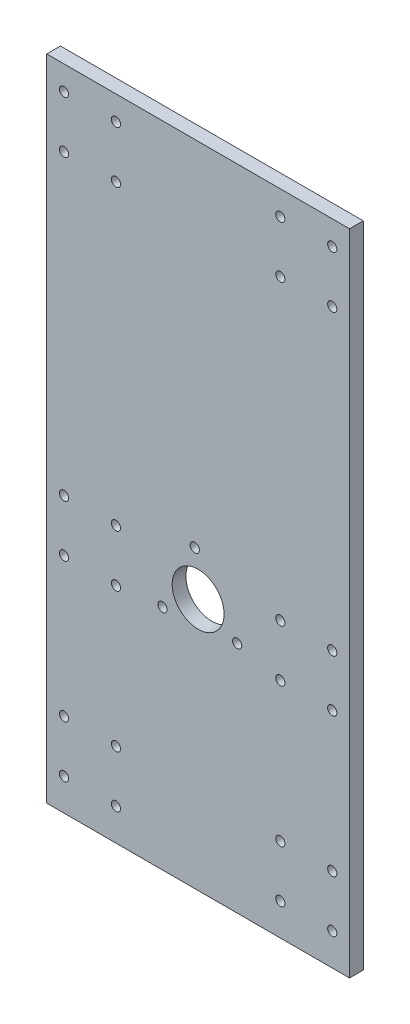
ISO-10303-21;
HEADER;
FILE_DESCRIPTION(('STEP AP214'),'2;1');
FILE_NAME('part.step','',(''),(''),'','','');
FILE_SCHEMA(('AUTOMOTIVE_DESIGN { 1 0 10303 214 1 1 1 1 }'));
ENDSEC;
DATA;
#1=APPLICATION_CONTEXT('core data for automotive mechanical design processes');
#2=APPLICATION_PROTOCOL_DEFINITION('international standard','automotive_design',2000,#1);
#3=PRODUCT_CONTEXT('',#1,'mechanical');
#4=PRODUCT('Part','Part','',(#3));
#5=PRODUCT_RELATED_PRODUCT_CATEGORY('part','',(#4));
#6=PRODUCT_DEFINITION_FORMATION('','',#4);
#7=PRODUCT_DEFINITION_CONTEXT('part definition',#1,'design');
#8=PRODUCT_DEFINITION('design','',#6,#7);
#9=PRODUCT_DEFINITION_SHAPE('','',#8);
#10=(LENGTH_UNIT() NAMED_UNIT(*) SI_UNIT(.MILLI.,.METRE.));
#11=(NAMED_UNIT(*) PLANE_ANGLE_UNIT() SI_UNIT($,.RADIAN.));
#12=(NAMED_UNIT(*) SI_UNIT($,.STERADIAN.) SOLID_ANGLE_UNIT());
#13=UNCERTAINTY_MEASURE_WITH_UNIT(LENGTH_MEASURE(1.E-05),#10,'distance_accuracy_value','');
#14=(GEOMETRIC_REPRESENTATION_CONTEXT(3) GLOBAL_UNCERTAINTY_ASSIGNED_CONTEXT((#13)) GLOBAL_UNIT_ASSIGNED_CONTEXT((#10,
#11,#12)) REPRESENTATION_CONTEXT('',''));
#15=CARTESIAN_POINT('',(0.,0.,0.));
#16=DIRECTION('',(0.,0.,1.));
#17=DIRECTION('',(1.,0.,0.));
#18=AXIS2_PLACEMENT_3D('',#15,#16,#17);
#19=CARTESIAN_POINT('',(0.,0.,6.35));
#20=DIRECTION('',(0.,0.,-1.));
#21=DIRECTION('',(-1.,0.,0.));
#22=AXIS2_PLACEMENT_3D('',#19,#20,#21);
#23=PLANE('',#22);
#24=CARTESIAN_POINT('',(-16.4847142677799,-44.6749368876676,6.35));
#25=DIRECTION('',(0.,0.,1.));
#26=DIRECTION('',(1.,0.,0.));
#27=AXIS2_PLACEMENT_3D('',#24,#25,#26);
#28=CIRCLE('',#27,2.125);
#29=CARTESIAN_POINT('',(-14.3597142677799,-44.6749368876676,6.35));
#30=VERTEX_POINT('',#29);
#31=EDGE_CURVE('E340',#30,#30,#28,.T.);
#32=ORIENTED_EDGE('',*,*,#31,.F.);
#33=EDGE_LOOP('',(#32));
#34=FACE_BOUND('',#33,.T.);
#35=CARTESIAN_POINT('',(18.0500401748656,-41.9637128861915,6.35));
#36=DIRECTION('',(0.,0.,1.));
#37=DIRECTION('',(1.,0.,0.));
#38=AXIS2_PLACEMENT_3D('',#35,#36,#37);
#39=CIRCLE('',#38,2.125);
#40=CARTESIAN_POINT('',(20.1750401748656,-41.9637128861915,6.35));
#41=VERTEX_POINT('',#40);
#42=EDGE_CURVE('E348',#41,#41,#39,.T.);
#43=ORIENTED_EDGE('',*,*,#42,.F.);
#44=EDGE_LOOP('',(#43));
#45=FACE_BOUND('',#44,.T.);
#46=CARTESIAN_POINT('',(-1.56532590708562,-13.4113502261411,6.35));
#47=DIRECTION('',(0.,0.,1.));
#48=DIRECTION('',(1.,0.,0.));
#49=AXIS2_PLACEMENT_3D('',#46,#47,#48);
#50=CIRCLE('',#49,2.125);
#51=CARTESIAN_POINT('',(0.559674092914378,-13.4113502261411,6.35));
#52=VERTEX_POINT('',#51);
#53=EDGE_CURVE('E332',#52,#52,#50,.T.);
#54=ORIENTED_EDGE('',*,*,#53,.F.);
#55=EDGE_LOOP('',(#54));
#56=FACE_BOUND('',#55,.T.);
#57=CARTESIAN_POINT('',(0.,-33.35,6.35));
#58=DIRECTION('',(0.,0.,1.));
#59=DIRECTION('',(1.,0.,0.));
#60=AXIS2_PLACEMENT_3D('',#57,#58,#59);
#61=CIRCLE('',#60,12.);
#62=CARTESIAN_POINT('',(12.,-33.35,6.35));
#63=VERTEX_POINT('',#62);
#64=EDGE_CURVE('E328',#63,#63,#61,.T.);
#65=ORIENTED_EDGE('',*,*,#64,.F.);
#66=EDGE_LOOP('',(#65));
#67=FACE_BOUND('',#66,.T.);
#68=DIRECTION('',(0.,1.,0.));
#69=VECTOR('',#68,1.);
#70=CARTESIAN_POINT('',(70.,-150.,6.35));
#71=LINE('',#70,#69);
#72=CARTESIAN_POINT('',(70.,-150.,6.35));
#73=VERTEX_POINT('',#72);
#74=CARTESIAN_POINT('',(70.,150.,6.35));
#75=VERTEX_POINT('',#74);
#76=EDGE_CURVE('E98',#73,#75,#71,.T.);
#77=ORIENTED_EDGE('',*,*,#76,.T.);
#78=DIRECTION('',(-1.,0.,0.));
#79=VECTOR('',#78,1.);
#80=CARTESIAN_POINT('',(-70.,150.,6.35));
#81=LINE('',#80,#79);
#82=CARTESIAN_POINT('',(-70.,150.,6.35));
#83=VERTEX_POINT('',#82);
#84=EDGE_CURVE('E93',#75,#83,#81,.T.);
#85=ORIENTED_EDGE('',*,*,#84,.T.);
#86=DIRECTION('',(0.,-1.,0.));
#87=VECTOR('',#86,1.);
#88=CARTESIAN_POINT('',(-70.,-150.,6.35));
#89=LINE('',#88,#87);
#90=CARTESIAN_POINT('',(-70.,-150.,6.35));
#91=VERTEX_POINT('',#90);
#92=EDGE_CURVE('E96',#83,#91,#89,.T.);
#93=ORIENTED_EDGE('',*,*,#92,.T.);
#94=DIRECTION('',(1.,0.,0.));
#95=VECTOR('',#94,1.);
#96=CARTESIAN_POINT('',(-70.,-150.,6.35));
#97=LINE('',#96,#95);
#98=EDGE_CURVE('E63',#91,#73,#97,.T.);
#99=ORIENTED_EDGE('',*,*,#98,.T.);
#100=EDGE_LOOP('',(#77,#85,#93,#99));
#101=FACE_BOUND('',#100,.T.);
#102=CARTESIAN_POINT('',(-62.,138.825,6.35));
#103=DIRECTION('',(0.,0.,1.));
#104=DIRECTION('',(1.,0.,0.));
#105=AXIS2_PLACEMENT_3D('',#102,#103,#104);
#106=CIRCLE('',#105,2.125);
#107=CARTESIAN_POINT('',(-59.875,138.825,6.35));
#108=VERTEX_POINT('',#107);
#109=EDGE_CURVE('E118',#108,#108,#106,.T.);
#110=ORIENTED_EDGE('',*,*,#109,.F.);
#111=EDGE_LOOP('',(#110));
#112=FACE_BOUND('',#111,.T.);
#113=CARTESIAN_POINT('',(-38.,138.825,6.35));
#114=DIRECTION('',(0.,0.,1.));
#115=DIRECTION('',(-1.,0.,0.));
#116=AXIS2_PLACEMENT_3D('',#113,#114,#115);
#117=CIRCLE('',#116,2.125);
#118=CARTESIAN_POINT('',(-40.125,138.825,6.35));
#119=VERTEX_POINT('',#118);
#120=EDGE_CURVE('E140',#119,#119,#117,.T.);
#121=ORIENTED_EDGE('',*,*,#120,.F.);
#122=EDGE_LOOP('',(#121));
#123=FACE_BOUND('',#122,.T.);
#124=CARTESIAN_POINT('',(-38.,114.825,6.35));
#125=DIRECTION('',(0.,0.,1.));
#126=DIRECTION('',(1.,0.,0.));
#127=AXIS2_PLACEMENT_3D('',#124,#125,#126);
#128=CIRCLE('',#127,2.125);
#129=CARTESIAN_POINT('',(-35.875,114.825,6.35));
#130=VERTEX_POINT('',#129);
#131=EDGE_CURVE('E148',#130,#130,#128,.T.);
#132=ORIENTED_EDGE('',*,*,#131,.F.);
#133=EDGE_LOOP('',(#132));
#134=FACE_BOUND('',#133,.T.);
#135=CARTESIAN_POINT('',(-62.,114.825,6.35));
#136=DIRECTION('',(0.,0.,1.));
#137=DIRECTION('',(-1.,0.,0.));
#138=AXIS2_PLACEMENT_3D('',#135,#136,#137);
#139=CIRCLE('',#138,2.125);
#140=CARTESIAN_POINT('',(-64.125,114.825,6.35));
#141=VERTEX_POINT('',#140);
#142=EDGE_CURVE('E156',#141,#141,#139,.T.);
#143=ORIENTED_EDGE('',*,*,#142,.F.);
#144=EDGE_LOOP('',(#143));
#145=FACE_BOUND('',#144,.T.);
#146=CARTESIAN_POINT('',(38.,114.825,6.35));
#147=DIRECTION('',(0.,0.,1.));
#148=DIRECTION('',(-1.,0.,0.));
#149=AXIS2_PLACEMENT_3D('',#146,#147,#148);
#150=CIRCLE('',#149,2.125);
#151=CARTESIAN_POINT('',(35.875,114.825,6.35));
#152=VERTEX_POINT('',#151);
#153=EDGE_CURVE('E164',#152,#152,#150,.T.);
#154=ORIENTED_EDGE('',*,*,#153,.F.);
#155=EDGE_LOOP('',(#154));
#156=FACE_BOUND('',#155,.T.);
#157=CARTESIAN_POINT('',(62.,114.825,6.35));
#158=DIRECTION('',(0.,0.,1.));
#159=DIRECTION('',(1.,0.,0.));
#160=AXIS2_PLACEMENT_3D('',#157,#158,#159);
#161=CIRCLE('',#160,2.12500000000001);
#162=CARTESIAN_POINT('',(64.125,114.825,6.35));
#163=VERTEX_POINT('',#162);
#164=EDGE_CURVE('E172',#163,#163,#161,.T.);
#165=ORIENTED_EDGE('',*,*,#164,.F.);
#166=EDGE_LOOP('',(#165));
#167=FACE_BOUND('',#166,.T.);
#168=CARTESIAN_POINT('',(38.,138.825,6.35));
#169=DIRECTION('',(0.,0.,1.));
#170=DIRECTION('',(1.,0.,0.));
#171=AXIS2_PLACEMENT_3D('',#168,#169,#170);
#172=CIRCLE('',#171,2.125);
#173=CARTESIAN_POINT('',(40.125,138.825,6.35));
#174=VERTEX_POINT('',#173);
#175=EDGE_CURVE('E180',#174,#174,#172,.T.);
#176=ORIENTED_EDGE('',*,*,#175,.F.);
#177=EDGE_LOOP('',(#176));
#178=FACE_BOUND('',#177,.T.);
#179=CARTESIAN_POINT('',(62.,138.825,6.35));
#180=DIRECTION('',(0.,0.,1.));
#181=DIRECTION('',(-1.,0.,0.));
#182=AXIS2_PLACEMENT_3D('',#179,#180,#181);
#183=CIRCLE('',#182,2.12500000000001);
#184=CARTESIAN_POINT('',(59.875,138.825,6.35));
#185=VERTEX_POINT('',#184);
#186=EDGE_CURVE('E188',#185,#185,#183,.T.);
#187=ORIENTED_EDGE('',*,*,#186,.F.);
#188=EDGE_LOOP('',(#187));
#189=FACE_BOUND('',#188,.T.);
#190=CARTESIAN_POINT('',(62.,-46.825,6.35));
#191=DIRECTION('',(0.,0.,1.));
#192=DIRECTION('',(1.,0.,0.));
#193=AXIS2_PLACEMENT_3D('',#190,#191,#192);
#194=CIRCLE('',#193,2.12500000000005);
#195=CARTESIAN_POINT('',(64.1250000000001,-46.825,6.35));
#196=VERTEX_POINT('',#195);
#197=EDGE_CURVE('E196',#196,#196,#194,.T.);
#198=ORIENTED_EDGE('',*,*,#197,.F.);
#199=EDGE_LOOP('',(#198));
#200=FACE_BOUND('',#199,.T.);
#201=CARTESIAN_POINT('',(38.,-46.825,6.35));
#202=DIRECTION('',(0.,0.,1.));
#203=DIRECTION('',(-1.,0.,0.));
#204=AXIS2_PLACEMENT_3D('',#201,#202,#203);
#205=CIRCLE('',#204,2.12499999999998);
#206=CARTESIAN_POINT('',(35.875,-46.825,6.35));
#207=VERTEX_POINT('',#206);
#208=EDGE_CURVE('E204',#207,#207,#205,.T.);
#209=ORIENTED_EDGE('',*,*,#208,.F.);
#210=EDGE_LOOP('',(#209));
#211=FACE_BOUND('',#210,.T.);
#212=CARTESIAN_POINT('',(62.,-22.825,6.35));
#213=DIRECTION('',(0.,0.,1.));
#214=DIRECTION('',(-1.,0.,0.));
#215=AXIS2_PLACEMENT_3D('',#212,#213,#214);
#216=CIRCLE('',#215,2.12500000000004);
#217=CARTESIAN_POINT('',(59.875,-22.825,6.35));
#218=VERTEX_POINT('',#217);
#219=EDGE_CURVE('E212',#218,#218,#216,.T.);
#220=ORIENTED_EDGE('',*,*,#219,.F.);
#221=EDGE_LOOP('',(#220));
#222=FACE_BOUND('',#221,.T.);
#223=CARTESIAN_POINT('',(38.,-22.825,6.35));
#224=DIRECTION('',(0.,0.,1.));
#225=DIRECTION('',(1.,0.,0.));
#226=AXIS2_PLACEMENT_3D('',#223,#224,#225);
#227=CIRCLE('',#226,2.12499999999999);
#228=CARTESIAN_POINT('',(40.125,-22.825,6.35));
#229=VERTEX_POINT('',#228);
#230=EDGE_CURVE('E220',#229,#229,#227,.T.);
#231=ORIENTED_EDGE('',*,*,#230,.F.);
#232=EDGE_LOOP('',(#231));
#233=FACE_BOUND('',#232,.T.);
#234=CARTESIAN_POINT('',(-62.,-22.825,6.35));
#235=DIRECTION('',(0.,0.,1.));
#236=DIRECTION('',(1.,0.,0.));
#237=AXIS2_PLACEMENT_3D('',#234,#235,#236);
#238=CIRCLE('',#237,2.12499999999999);
#239=CARTESIAN_POINT('',(-59.875,-22.825,6.35));
#240=VERTEX_POINT('',#239);
#241=EDGE_CURVE('E228',#240,#240,#238,.T.);
#242=ORIENTED_EDGE('',*,*,#241,.F.);
#243=EDGE_LOOP('',(#242));
#244=FACE_BOUND('',#243,.T.);
#245=CARTESIAN_POINT('',(-38.,-22.825,6.35));
#246=DIRECTION('',(0.,0.,1.));
#247=DIRECTION('',(-1.,0.,0.));
#248=AXIS2_PLACEMENT_3D('',#245,#246,#247);
#249=CIRCLE('',#248,2.12499999999999);
#250=CARTESIAN_POINT('',(-40.125,-22.825,6.35));
#251=VERTEX_POINT('',#250);
#252=EDGE_CURVE('E236',#251,#251,#249,.T.);
#253=ORIENTED_EDGE('',*,*,#252,.F.);
#254=EDGE_LOOP('',(#253));
#255=FACE_BOUND('',#254,.T.);
#256=CARTESIAN_POINT('',(-38.,-46.825,6.35));
#257=DIRECTION('',(0.,0.,1.));
#258=DIRECTION('',(1.,0.,0.));
#259=AXIS2_PLACEMENT_3D('',#256,#257,#258);
#260=CIRCLE('',#259,2.12499999999998);
#261=CARTESIAN_POINT('',(-35.875,-46.825,6.35));
#262=VERTEX_POINT('',#261);
#263=EDGE_CURVE('E244',#262,#262,#260,.T.);
#264=ORIENTED_EDGE('',*,*,#263,.F.);
#265=EDGE_LOOP('',(#264));
#266=FACE_BOUND('',#265,.T.);
#267=CARTESIAN_POINT('',(-62.,-46.825,6.35));
#268=DIRECTION('',(0.,0.,1.));
#269=DIRECTION('',(-1.,0.,0.));
#270=AXIS2_PLACEMENT_3D('',#267,#268,#269);
#271=CIRCLE('',#270,2.12499999999998);
#272=CARTESIAN_POINT('',(-64.125,-46.825,6.35));
#273=VERTEX_POINT('',#272);
#274=EDGE_CURVE('E252',#273,#273,#271,.T.);
#275=ORIENTED_EDGE('',*,*,#274,.F.);
#276=EDGE_LOOP('',(#275));
#277=FACE_BOUND('',#276,.T.);
#278=CARTESIAN_POINT('',(-62.,-111.175,6.35));
#279=DIRECTION('',(0.,0.,1.));
#280=DIRECTION('',(1.,0.,0.));
#281=AXIS2_PLACEMENT_3D('',#278,#279,#280);
#282=CIRCLE('',#281,2.125);
#283=CARTESIAN_POINT('',(-59.875,-111.175,6.35));
#284=VERTEX_POINT('',#283);
#285=EDGE_CURVE('E260',#284,#284,#282,.T.);
#286=ORIENTED_EDGE('',*,*,#285,.F.);
#287=EDGE_LOOP('',(#286));
#288=FACE_BOUND('',#287,.T.);
#289=CARTESIAN_POINT('',(-38.,-111.175,6.35));
#290=DIRECTION('',(0.,0.,1.));
#291=DIRECTION('',(-1.,0.,0.));
#292=AXIS2_PLACEMENT_3D('',#289,#290,#291);
#293=CIRCLE('',#292,2.12500000000001);
#294=CARTESIAN_POINT('',(-40.125,-111.175,6.35));
#295=VERTEX_POINT('',#294);
#296=EDGE_CURVE('E268',#295,#295,#293,.T.);
#297=ORIENTED_EDGE('',*,*,#296,.F.);
#298=EDGE_LOOP('',(#297));
#299=FACE_BOUND('',#298,.T.);
#300=CARTESIAN_POINT('',(-38.,-135.175,6.35));
#301=DIRECTION('',(0.,0.,1.));
#302=DIRECTION('',(1.,0.,0.));
#303=AXIS2_PLACEMENT_3D('',#300,#301,#302);
#304=CIRCLE('',#303,2.12500000000002);
#305=CARTESIAN_POINT('',(-35.875,-135.175,6.35));
#306=VERTEX_POINT('',#305);
#307=EDGE_CURVE('E276',#306,#306,#304,.T.);
#308=ORIENTED_EDGE('',*,*,#307,.F.);
#309=EDGE_LOOP('',(#308));
#310=FACE_BOUND('',#309,.T.);
#311=CARTESIAN_POINT('',(-62.,-135.175,6.35));
#312=DIRECTION('',(0.,0.,1.));
#313=DIRECTION('',(-1.,0.,0.));
#314=AXIS2_PLACEMENT_3D('',#311,#312,#313);
#315=CIRCLE('',#314,2.125);
#316=CARTESIAN_POINT('',(-64.125,-135.175,6.35));
#317=VERTEX_POINT('',#316);
#318=EDGE_CURVE('E284',#317,#317,#315,.T.);
#319=ORIENTED_EDGE('',*,*,#318,.F.);
#320=EDGE_LOOP('',(#319));
#321=FACE_BOUND('',#320,.T.);
#322=CARTESIAN_POINT('',(38.,-135.175,6.35));
#323=DIRECTION('',(0.,0.,1.));
#324=DIRECTION('',(-1.,0.,0.));
#325=AXIS2_PLACEMENT_3D('',#322,#323,#324);
#326=CIRCLE('',#325,2.12499999999999);
#327=CARTESIAN_POINT('',(35.875,-135.175,6.35));
#328=VERTEX_POINT('',#327);
#329=EDGE_CURVE('E292',#328,#328,#326,.T.);
#330=ORIENTED_EDGE('',*,*,#329,.F.);
#331=EDGE_LOOP('',(#330));
#332=FACE_BOUND('',#331,.T.);
#333=CARTESIAN_POINT('',(62.,-135.175,6.35));
#334=DIRECTION('',(0.,0.,1.));
#335=DIRECTION('',(1.,0.,0.));
#336=AXIS2_PLACEMENT_3D('',#333,#334,#335);
#337=CIRCLE('',#336,2.12500000000002);
#338=CARTESIAN_POINT('',(64.125,-135.175,6.35));
#339=VERTEX_POINT('',#338);
#340=EDGE_CURVE('E300',#339,#339,#337,.T.);
#341=ORIENTED_EDGE('',*,*,#340,.F.);
#342=EDGE_LOOP('',(#341));
#343=FACE_BOUND('',#342,.T.);
#344=CARTESIAN_POINT('',(38.,-111.175,6.35));
#345=DIRECTION('',(0.,0.,1.));
#346=DIRECTION('',(1.,0.,0.));
#347=AXIS2_PLACEMENT_3D('',#344,#345,#346);
#348=CIRCLE('',#347,2.125);
#349=CARTESIAN_POINT('',(40.125,-111.175,6.35));
#350=VERTEX_POINT('',#349);
#351=EDGE_CURVE('E308',#350,#350,#348,.T.);
#352=ORIENTED_EDGE('',*,*,#351,.F.);
#353=EDGE_LOOP('',(#352));
#354=FACE_BOUND('',#353,.T.);
#355=CARTESIAN_POINT('',(62.,-111.175,6.35));
#356=DIRECTION('',(0.,0.,1.));
#357=DIRECTION('',(-1.,0.,0.));
#358=AXIS2_PLACEMENT_3D('',#355,#356,#357);
#359=CIRCLE('',#358,2.12500000000001);
#360=CARTESIAN_POINT('',(59.875,-111.175,6.35));
#361=VERTEX_POINT('',#360);
#362=EDGE_CURVE('E316',#361,#361,#359,.T.);
#363=ORIENTED_EDGE('',*,*,#362,.F.);
#364=EDGE_LOOP('',(#363));
#365=FACE_BOUND('',#364,.T.);
#366=ADVANCED_FACE('F45',(#34,#45,#56,#67,#101,#112,#123,#134,#145,#156,#167,#178,#189,#200,
#211,#222,#233,#244,#255,#266,#277,#288,#299,#310,#321,#332,#343,#354,#365),#23,.F.);
#367=CARTESIAN_POINT('',(0.,0.,0.));
#368=DIRECTION('',(0.,0.,-1.));
#369=DIRECTION('',(-1.,0.,0.));
#370=AXIS2_PLACEMENT_3D('',#367,#368,#369);
#371=PLANE('',#370);
#372=CARTESIAN_POINT('',(-16.4847142677799,-44.6749368876676,0.));
#373=DIRECTION('',(0.,0.,1.));
#374=DIRECTION('',(1.,0.,0.));
#375=AXIS2_PLACEMENT_3D('',#372,#373,#374);
#376=CIRCLE('',#375,2.125);
#377=CARTESIAN_POINT('',(-14.3597142677799,-44.6749368876676,0.));
#378=VERTEX_POINT('',#377);
#379=EDGE_CURVE('E336',#378,#378,#376,.T.);
#380=ORIENTED_EDGE('',*,*,#379,.T.);
#381=EDGE_LOOP('',(#380));
#382=FACE_BOUND('',#381,.T.);
#383=CARTESIAN_POINT('',(18.0500401748656,-41.9637128861915,0.));
#384=DIRECTION('',(0.,0.,1.));
#385=DIRECTION('',(1.,0.,0.));
#386=AXIS2_PLACEMENT_3D('',#383,#384,#385);
#387=CIRCLE('',#386,2.125);
#388=CARTESIAN_POINT('',(20.1750401748656,-41.9637128861915,0.));
#389=VERTEX_POINT('',#388);
#390=EDGE_CURVE('E344',#389,#389,#387,.T.);
#391=ORIENTED_EDGE('',*,*,#390,.T.);
#392=EDGE_LOOP('',(#391));
#393=FACE_BOUND('',#392,.T.);
#394=CARTESIAN_POINT('',(-1.56532590708562,-13.4113502261411,0.));
#395=DIRECTION('',(0.,0.,1.));
#396=DIRECTION('',(1.,0.,0.));
#397=AXIS2_PLACEMENT_3D('',#394,#395,#396);
#398=CIRCLE('',#397,2.125);
#399=CARTESIAN_POINT('',(0.559674092914378,-13.4113502261411,0.));
#400=VERTEX_POINT('',#399);
#401=EDGE_CURVE('E352',#400,#400,#398,.T.);
#402=ORIENTED_EDGE('',*,*,#401,.T.);
#403=EDGE_LOOP('',(#402));
#404=FACE_BOUND('',#403,.T.);
#405=CARTESIAN_POINT('',(0.,-33.35,0.));
#406=DIRECTION('',(0.,0.,1.));
#407=DIRECTION('',(1.,0.,0.));
#408=AXIS2_PLACEMENT_3D('',#405,#406,#407);
#409=CIRCLE('',#408,12.);
#410=CARTESIAN_POINT('',(12.,-33.35,0.));
#411=VERTEX_POINT('',#410);
#412=EDGE_CURVE('E324',#411,#411,#409,.T.);
#413=ORIENTED_EDGE('',*,*,#412,.T.);
#414=EDGE_LOOP('',(#413));
#415=FACE_BOUND('',#414,.T.);
#416=CARTESIAN_POINT('',(38.,-111.175,0.));
#417=DIRECTION('',(0.,0.,1.));
#418=DIRECTION('',(1.,0.,0.));
#419=AXIS2_PLACEMENT_3D('',#416,#417,#418);
#420=CIRCLE('',#419,2.125);
#421=CARTESIAN_POINT('',(40.125,-111.175,0.));
#422=VERTEX_POINT('',#421);
#423=EDGE_CURVE('E312',#422,#422,#420,.T.);
#424=ORIENTED_EDGE('',*,*,#423,.T.);
#425=EDGE_LOOP('',(#424));
#426=FACE_BOUND('',#425,.T.);
#427=CARTESIAN_POINT('',(38.,-135.175,0.));
#428=DIRECTION('',(0.,0.,1.));
#429=DIRECTION('',(-1.,0.,0.));
#430=AXIS2_PLACEMENT_3D('',#427,#428,#429);
#431=CIRCLE('',#430,2.12499999999999);
#432=CARTESIAN_POINT('',(35.875,-135.175,0.));
#433=VERTEX_POINT('',#432);
#434=EDGE_CURVE('E296',#433,#433,#431,.T.);
#435=ORIENTED_EDGE('',*,*,#434,.T.);
#436=EDGE_LOOP('',(#435));
#437=FACE_BOUND('',#436,.T.);
#438=CARTESIAN_POINT('',(-38.,-135.175,0.));
#439=DIRECTION('',(0.,0.,1.));
#440=DIRECTION('',(1.,0.,0.));
#441=AXIS2_PLACEMENT_3D('',#438,#439,#440);
#442=CIRCLE('',#441,2.12500000000002);
#443=CARTESIAN_POINT('',(-35.875,-135.175,0.));
#444=VERTEX_POINT('',#443);
#445=EDGE_CURVE('E280',#444,#444,#442,.T.);
#446=ORIENTED_EDGE('',*,*,#445,.T.);
#447=EDGE_LOOP('',(#446));
#448=FACE_BOUND('',#447,.T.);
#449=CARTESIAN_POINT('',(-62.,-111.175,0.));
#450=DIRECTION('',(0.,0.,1.));
#451=DIRECTION('',(1.,0.,0.));
#452=AXIS2_PLACEMENT_3D('',#449,#450,#451);
#453=CIRCLE('',#452,2.125);
#454=CARTESIAN_POINT('',(-59.875,-111.175,0.));
#455=VERTEX_POINT('',#454);
#456=EDGE_CURVE('E264',#455,#455,#453,.T.);
#457=ORIENTED_EDGE('',*,*,#456,.T.);
#458=EDGE_LOOP('',(#457));
#459=FACE_BOUND('',#458,.T.);
#460=CARTESIAN_POINT('',(-38.,-46.825,0.));
#461=DIRECTION('',(0.,0.,1.));
#462=DIRECTION('',(1.,0.,0.));
#463=AXIS2_PLACEMENT_3D('',#460,#461,#462);
#464=CIRCLE('',#463,2.12499999999998);
#465=CARTESIAN_POINT('',(-35.875,-46.825,0.));
#466=VERTEX_POINT('',#465);
#467=EDGE_CURVE('E248',#466,#466,#464,.T.);
#468=ORIENTED_EDGE('',*,*,#467,.T.);
#469=EDGE_LOOP('',(#468));
#470=FACE_BOUND('',#469,.T.);
#471=CARTESIAN_POINT('',(-62.,-22.825,0.));
#472=DIRECTION('',(0.,0.,1.));
#473=DIRECTION('',(1.,0.,0.));
#474=AXIS2_PLACEMENT_3D('',#471,#472,#473);
#475=CIRCLE('',#474,2.12499999999999);
#476=CARTESIAN_POINT('',(-59.875,-22.825,0.));
#477=VERTEX_POINT('',#476);
#478=EDGE_CURVE('E232',#477,#477,#475,.T.);
#479=ORIENTED_EDGE('',*,*,#478,.T.);
#480=EDGE_LOOP('',(#479));
#481=FACE_BOUND('',#480,.T.);
#482=CARTESIAN_POINT('',(62.,-22.825,0.));
#483=DIRECTION('',(0.,0.,1.));
#484=DIRECTION('',(-1.,0.,0.));
#485=AXIS2_PLACEMENT_3D('',#482,#483,#484);
#486=CIRCLE('',#485,2.12500000000004);
#487=CARTESIAN_POINT('',(59.875,-22.825,0.));
#488=VERTEX_POINT('',#487);
#489=EDGE_CURVE('E216',#488,#488,#486,.T.);
#490=ORIENTED_EDGE('',*,*,#489,.T.);
#491=EDGE_LOOP('',(#490));
#492=FACE_BOUND('',#491,.T.);
#493=CARTESIAN_POINT('',(62.,-46.825,0.));
#494=DIRECTION('',(0.,0.,1.));
#495=DIRECTION('',(1.,0.,0.));
#496=AXIS2_PLACEMENT_3D('',#493,#494,#495);
#497=CIRCLE('',#496,2.12500000000005);
#498=CARTESIAN_POINT('',(64.1250000000001,-46.825,0.));
#499=VERTEX_POINT('',#498);
#500=EDGE_CURVE('E200',#499,#499,#497,.T.);
#501=ORIENTED_EDGE('',*,*,#500,.T.);
#502=EDGE_LOOP('',(#501));
#503=FACE_BOUND('',#502,.T.);
#504=CARTESIAN_POINT('',(38.,138.825,0.));
#505=DIRECTION('',(0.,0.,1.));
#506=DIRECTION('',(1.,0.,0.));
#507=AXIS2_PLACEMENT_3D('',#504,#505,#506);
#508=CIRCLE('',#507,2.125);
#509=CARTESIAN_POINT('',(40.125,138.825,0.));
#510=VERTEX_POINT('',#509);
#511=EDGE_CURVE('E184',#510,#510,#508,.T.);
#512=ORIENTED_EDGE('',*,*,#511,.T.);
#513=EDGE_LOOP('',(#512));
#514=FACE_BOUND('',#513,.T.);
#515=CARTESIAN_POINT('',(38.,114.825,0.));
#516=DIRECTION('',(0.,0.,1.));
#517=DIRECTION('',(-1.,0.,0.));
#518=AXIS2_PLACEMENT_3D('',#515,#516,#517);
#519=CIRCLE('',#518,2.125);
#520=CARTESIAN_POINT('',(35.875,114.825,0.));
#521=VERTEX_POINT('',#520);
#522=EDGE_CURVE('E168',#521,#521,#519,.T.);
#523=ORIENTED_EDGE('',*,*,#522,.T.);
#524=EDGE_LOOP('',(#523));
#525=FACE_BOUND('',#524,.T.);
#526=CARTESIAN_POINT('',(-38.,114.825,0.));
#527=DIRECTION('',(0.,0.,1.));
#528=DIRECTION('',(1.,0.,0.));
#529=AXIS2_PLACEMENT_3D('',#526,#527,#528);
#530=CIRCLE('',#529,2.125);
#531=CARTESIAN_POINT('',(-35.875,114.825,0.));
#532=VERTEX_POINT('',#531);
#533=EDGE_CURVE('E152',#532,#532,#530,.T.);
#534=ORIENTED_EDGE('',*,*,#533,.T.);
#535=EDGE_LOOP('',(#534));
#536=FACE_BOUND('',#535,.T.);
#537=CARTESIAN_POINT('',(-62.,138.825,0.));
#538=DIRECTION('',(0.,0.,1.));
#539=DIRECTION('',(1.,0.,0.));
#540=AXIS2_PLACEMENT_3D('',#537,#538,#539);
#541=CIRCLE('',#540,2.125);
#542=CARTESIAN_POINT('',(-59.875,138.825,0.));
#543=VERTEX_POINT('',#542);
#544=EDGE_CURVE('E136',#543,#543,#541,.T.);
#545=ORIENTED_EDGE('',*,*,#544,.T.);
#546=EDGE_LOOP('',(#545));
#547=FACE_BOUND('',#546,.T.);
#548=DIRECTION('',(0.,1.,0.));
#549=VECTOR('',#548,1.);
#550=CARTESIAN_POINT('',(70.,-150.,0.));
#551=LINE('',#550,#549);
#552=CARTESIAN_POINT('',(70.,-150.,0.));
#553=VERTEX_POINT('',#552);
#554=CARTESIAN_POINT('',(70.,150.,0.));
#555=VERTEX_POINT('',#554);
#556=EDGE_CURVE('E114',#553,#555,#551,.T.);
#557=ORIENTED_EDGE('',*,*,#556,.F.);
#558=DIRECTION('',(1.,0.,0.));
#559=VECTOR('',#558,1.);
#560=CARTESIAN_POINT('',(-70.,-150.,0.));
#561=LINE('',#560,#559);
#562=CARTESIAN_POINT('',(-70.,-150.,0.));
#563=VERTEX_POINT('',#562);
#564=EDGE_CURVE('E86',#563,#553,#561,.T.);
#565=ORIENTED_EDGE('',*,*,#564,.F.);
#566=DIRECTION('',(0.,-1.,0.));
#567=VECTOR('',#566,1.);
#568=CARTESIAN_POINT('',(-70.,-150.,0.));
#569=LINE('',#568,#567);
#570=CARTESIAN_POINT('',(-70.,150.,0.));
#571=VERTEX_POINT('',#570);
#572=EDGE_CURVE('E80',#571,#563,#569,.T.);
#573=ORIENTED_EDGE('',*,*,#572,.F.);
#574=DIRECTION('',(-1.,0.,0.));
#575=VECTOR('',#574,1.);
#576=CARTESIAN_POINT('',(-70.,150.,0.));
#577=LINE('',#576,#575);
#578=EDGE_CURVE('E103',#555,#571,#577,.T.);
#579=ORIENTED_EDGE('',*,*,#578,.F.);
#580=EDGE_LOOP('',(#557,#565,#573,#579));
#581=FACE_BOUND('',#580,.T.);
#582=CARTESIAN_POINT('',(-38.,138.825,0.));
#583=DIRECTION('',(0.,0.,1.));
#584=DIRECTION('',(-1.,0.,0.));
#585=AXIS2_PLACEMENT_3D('',#582,#583,#584);
#586=CIRCLE('',#585,2.125);
#587=CARTESIAN_POINT('',(-40.125,138.825,0.));
#588=VERTEX_POINT('',#587);
#589=EDGE_CURVE('E144',#588,#588,#586,.T.);
#590=ORIENTED_EDGE('',*,*,#589,.T.);
#591=EDGE_LOOP('',(#590));
#592=FACE_BOUND('',#591,.T.);
#593=CARTESIAN_POINT('',(-62.,114.825,0.));
#594=DIRECTION('',(0.,0.,1.));
#595=DIRECTION('',(-1.,0.,0.));
#596=AXIS2_PLACEMENT_3D('',#593,#594,#595);
#597=CIRCLE('',#596,2.125);
#598=CARTESIAN_POINT('',(-64.125,114.825,0.));
#599=VERTEX_POINT('',#598);
#600=EDGE_CURVE('E160',#599,#599,#597,.T.);
#601=ORIENTED_EDGE('',*,*,#600,.T.);
#602=EDGE_LOOP('',(#601));
#603=FACE_BOUND('',#602,.T.);
#604=CARTESIAN_POINT('',(62.,114.825,0.));
#605=DIRECTION('',(0.,0.,1.));
#606=DIRECTION('',(1.,0.,0.));
#607=AXIS2_PLACEMENT_3D('',#604,#605,#606);
#608=CIRCLE('',#607,2.12500000000001);
#609=CARTESIAN_POINT('',(64.125,114.825,0.));
#610=VERTEX_POINT('',#609);
#611=EDGE_CURVE('E176',#610,#610,#608,.T.);
#612=ORIENTED_EDGE('',*,*,#611,.T.);
#613=EDGE_LOOP('',(#612));
#614=FACE_BOUND('',#613,.T.);
#615=CARTESIAN_POINT('',(62.,138.825,0.));
#616=DIRECTION('',(0.,0.,1.));
#617=DIRECTION('',(-1.,0.,0.));
#618=AXIS2_PLACEMENT_3D('',#615,#616,#617);
#619=CIRCLE('',#618,2.12500000000001);
#620=CARTESIAN_POINT('',(59.875,138.825,0.));
#621=VERTEX_POINT('',#620);
#622=EDGE_CURVE('E192',#621,#621,#619,.T.);
#623=ORIENTED_EDGE('',*,*,#622,.T.);
#624=EDGE_LOOP('',(#623));
#625=FACE_BOUND('',#624,.T.);
#626=CARTESIAN_POINT('',(38.,-46.825,0.));
#627=DIRECTION('',(0.,0.,1.));
#628=DIRECTION('',(-1.,0.,0.));
#629=AXIS2_PLACEMENT_3D('',#626,#627,#628);
#630=CIRCLE('',#629,2.12499999999998);
#631=CARTESIAN_POINT('',(35.875,-46.825,0.));
#632=VERTEX_POINT('',#631);
#633=EDGE_CURVE('E208',#632,#632,#630,.T.);
#634=ORIENTED_EDGE('',*,*,#633,.T.);
#635=EDGE_LOOP('',(#634));
#636=FACE_BOUND('',#635,.T.);
#637=CARTESIAN_POINT('',(38.,-22.825,0.));
#638=DIRECTION('',(0.,0.,1.));
#639=DIRECTION('',(1.,0.,0.));
#640=AXIS2_PLACEMENT_3D('',#637,#638,#639);
#641=CIRCLE('',#640,2.12499999999999);
#642=CARTESIAN_POINT('',(40.125,-22.825,0.));
#643=VERTEX_POINT('',#642);
#644=EDGE_CURVE('E224',#643,#643,#641,.T.);
#645=ORIENTED_EDGE('',*,*,#644,.T.);
#646=EDGE_LOOP('',(#645));
#647=FACE_BOUND('',#646,.T.);
#648=CARTESIAN_POINT('',(-38.,-22.825,0.));
#649=DIRECTION('',(0.,0.,1.));
#650=DIRECTION('',(-1.,0.,0.));
#651=AXIS2_PLACEMENT_3D('',#648,#649,#650);
#652=CIRCLE('',#651,2.12499999999999);
#653=CARTESIAN_POINT('',(-40.125,-22.825,0.));
#654=VERTEX_POINT('',#653);
#655=EDGE_CURVE('E240',#654,#654,#652,.T.);
#656=ORIENTED_EDGE('',*,*,#655,.T.);
#657=EDGE_LOOP('',(#656));
#658=FACE_BOUND('',#657,.T.);
#659=CARTESIAN_POINT('',(-62.,-46.825,0.));
#660=DIRECTION('',(0.,0.,1.));
#661=DIRECTION('',(-1.,0.,0.));
#662=AXIS2_PLACEMENT_3D('',#659,#660,#661);
#663=CIRCLE('',#662,2.12499999999998);
#664=CARTESIAN_POINT('',(-64.125,-46.825,0.));
#665=VERTEX_POINT('',#664);
#666=EDGE_CURVE('E256',#665,#665,#663,.T.);
#667=ORIENTED_EDGE('',*,*,#666,.T.);
#668=EDGE_LOOP('',(#667));
#669=FACE_BOUND('',#668,.T.);
#670=CARTESIAN_POINT('',(-38.,-111.175,0.));
#671=DIRECTION('',(0.,0.,1.));
#672=DIRECTION('',(-1.,0.,0.));
#673=AXIS2_PLACEMENT_3D('',#670,#671,#672);
#674=CIRCLE('',#673,2.12500000000001);
#675=CARTESIAN_POINT('',(-40.125,-111.175,0.));
#676=VERTEX_POINT('',#675);
#677=EDGE_CURVE('E272',#676,#676,#674,.T.);
#678=ORIENTED_EDGE('',*,*,#677,.T.);
#679=EDGE_LOOP('',(#678));
#680=FACE_BOUND('',#679,.T.);
#681=CARTESIAN_POINT('',(-62.,-135.175,0.));
#682=DIRECTION('',(0.,0.,1.));
#683=DIRECTION('',(-1.,0.,0.));
#684=AXIS2_PLACEMENT_3D('',#681,#682,#683);
#685=CIRCLE('',#684,2.125);
#686=CARTESIAN_POINT('',(-64.125,-135.175,0.));
#687=VERTEX_POINT('',#686);
#688=EDGE_CURVE('E288',#687,#687,#685,.T.);
#689=ORIENTED_EDGE('',*,*,#688,.T.);
#690=EDGE_LOOP('',(#689));
#691=FACE_BOUND('',#690,.T.);
#692=CARTESIAN_POINT('',(62.,-135.175,0.));
#693=DIRECTION('',(0.,0.,1.));
#694=DIRECTION('',(1.,0.,0.));
#695=AXIS2_PLACEMENT_3D('',#692,#693,#694);
#696=CIRCLE('',#695,2.12500000000002);
#697=CARTESIAN_POINT('',(64.125,-135.175,0.));
#698=VERTEX_POINT('',#697);
#699=EDGE_CURVE('E304',#698,#698,#696,.T.);
#700=ORIENTED_EDGE('',*,*,#699,.T.);
#701=EDGE_LOOP('',(#700));
#702=FACE_BOUND('',#701,.T.);
#703=CARTESIAN_POINT('',(62.,-111.175,0.));
#704=DIRECTION('',(0.,0.,1.));
#705=DIRECTION('',(-1.,0.,0.));
#706=AXIS2_PLACEMENT_3D('',#703,#704,#705);
#707=CIRCLE('',#706,2.12500000000001);
#708=CARTESIAN_POINT('',(59.875,-111.175,0.));
#709=VERTEX_POINT('',#708);
#710=EDGE_CURVE('E320',#709,#709,#707,.T.);
#711=ORIENTED_EDGE('',*,*,#710,.T.);
#712=EDGE_LOOP('',(#711));
#713=FACE_BOUND('',#712,.T.);
#714=ADVANCED_FACE('F131',(#382,#393,#404,#415,#426,#437,#448,#459,#470,#481,#492,#503,#514,
#525,#536,#547,#581,#592,#603,#614,#625,#636,#647,#658,#669,#680,#691,#702,#713),#371,.T.);
#715=CARTESIAN_POINT('',(70.,-150.,6.35));
#716=DIRECTION('',(-1.,0.,0.));
#717=DIRECTION('',(0.,0.,1.));
#718=AXIS2_PLACEMENT_3D('',#715,#716,#717);
#719=PLANE('',#718);
#720=ORIENTED_EDGE('',*,*,#556,.T.);
#721=DIRECTION('',(0.,0.,-1.));
#722=VECTOR('',#721,1.);
#723=CARTESIAN_POINT('',(70.,150.,6.35));
#724=LINE('',#723,#722);
#725=EDGE_CURVE('E11',#75,#555,#724,.T.);
#726=ORIENTED_EDGE('',*,*,#725,.F.);
#727=ORIENTED_EDGE('',*,*,#76,.F.);
#728=DIRECTION('',(0.,0.,-1.));
#729=VECTOR('',#728,1.);
#730=CARTESIAN_POINT('',(70.,-150.,6.35));
#731=LINE('',#730,#729);
#732=EDGE_CURVE('E110',#73,#553,#731,.T.);
#733=ORIENTED_EDGE('',*,*,#732,.T.);
#734=EDGE_LOOP('',(#720,#726,#727,#733));
#735=FACE_BOUND('',#734,.T.);
#736=ADVANCED_FACE('F47',(#735),#719,.F.);
#737=CARTESIAN_POINT('',(-70.,150.,6.35));
#738=DIRECTION('',(0.,-1.,0.));
#739=DIRECTION('',(0.,0.,-1.));
#740=AXIS2_PLACEMENT_3D('',#737,#738,#739);
#741=PLANE('',#740);
#742=ORIENTED_EDGE('',*,*,#578,.T.);
#743=DIRECTION('',(0.,0.,-1.));
#744=VECTOR('',#743,1.);
#745=CARTESIAN_POINT('',(-70.,150.,6.35));
#746=LINE('',#745,#744);
#747=EDGE_CURVE('E55',#83,#571,#746,.T.);
#748=ORIENTED_EDGE('',*,*,#747,.F.);
#749=ORIENTED_EDGE('',*,*,#84,.F.);
#750=ORIENTED_EDGE('',*,*,#725,.T.);
#751=EDGE_LOOP('',(#742,#748,#749,#750));
#752=FACE_BOUND('',#751,.T.);
#753=ADVANCED_FACE('F102',(#752),#741,.F.);
#754=CARTESIAN_POINT('',(-70.,-150.,6.35));
#755=DIRECTION('',(1.,0.,0.));
#756=DIRECTION('',(0.,0.,-1.));
#757=AXIS2_PLACEMENT_3D('',#754,#755,#756);
#758=PLANE('',#757);
#759=ORIENTED_EDGE('',*,*,#572,.T.);
#760=DIRECTION('',(0.,0.,-1.));
#761=VECTOR('',#760,1.);
#762=CARTESIAN_POINT('',(-70.,-150.,6.35));
#763=LINE('',#762,#761);
#764=EDGE_CURVE('E105',#91,#563,#763,.T.);
#765=ORIENTED_EDGE('',*,*,#764,.F.);
#766=ORIENTED_EDGE('',*,*,#92,.F.);
#767=ORIENTED_EDGE('',*,*,#747,.T.);
#768=EDGE_LOOP('',(#759,#765,#766,#767));
#769=FACE_BOUND('',#768,.T.);
#770=ADVANCED_FACE('F106',(#769),#758,.F.);
#771=CARTESIAN_POINT('',(-70.,-150.,6.35));
#772=DIRECTION('',(0.,1.,0.));
#773=DIRECTION('',(0.,0.,1.));
#774=AXIS2_PLACEMENT_3D('',#771,#772,#773);
#775=PLANE('',#774);
#776=ORIENTED_EDGE('',*,*,#564,.T.);
#777=ORIENTED_EDGE('',*,*,#732,.F.);
#778=ORIENTED_EDGE('',*,*,#98,.F.);
#779=ORIENTED_EDGE('',*,*,#764,.T.);
#780=EDGE_LOOP('',(#776,#777,#778,#779));
#781=FACE_BOUND('',#780,.T.);
#782=ADVANCED_FACE('F128',(#781),#775,.F.);
#783=CARTESIAN_POINT('',(-62.,138.825,6.35));
#784=DIRECTION('',(0.,0.,-1.));
#785=DIRECTION('',(-1.,0.,0.));
#786=AXIS2_PLACEMENT_3D('',#783,#784,#785);
#787=CYLINDRICAL_SURFACE('',#786,2.125);
#788=ORIENTED_EDGE('',*,*,#109,.T.);
#789=EDGE_LOOP('',(#788));
#790=FACE_BOUND('',#789,.T.);
#791=ORIENTED_EDGE('',*,*,#544,.F.);
#792=EDGE_LOOP('',(#791));
#793=FACE_BOUND('',#792,.T.);
#794=ADVANCED_FACE('F475',(#790,#793),#787,.F.);
#795=CARTESIAN_POINT('',(-38.,138.825,6.35));
#796=DIRECTION('',(0.,0.,-1.));
#797=DIRECTION('',(-1.,0.,0.));
#798=AXIS2_PLACEMENT_3D('',#795,#796,#797);
#799=CYLINDRICAL_SURFACE('',#798,2.125);
#800=ORIENTED_EDGE('',*,*,#120,.T.);
#801=EDGE_LOOP('',(#800));
#802=FACE_BOUND('',#801,.T.);
#803=ORIENTED_EDGE('',*,*,#589,.F.);
#804=EDGE_LOOP('',(#803));
#805=FACE_BOUND('',#804,.T.);
#806=ADVANCED_FACE('F471',(#802,#805),#799,.F.);
#807=CARTESIAN_POINT('',(-38.,114.825,6.35));
#808=DIRECTION('',(0.,0.,-1.));
#809=DIRECTION('',(-1.,0.,0.));
#810=AXIS2_PLACEMENT_3D('',#807,#808,#809);
#811=CYLINDRICAL_SURFACE('',#810,2.125);
#812=ORIENTED_EDGE('',*,*,#131,.T.);
#813=EDGE_LOOP('',(#812));
#814=FACE_BOUND('',#813,.T.);
#815=ORIENTED_EDGE('',*,*,#533,.F.);
#816=EDGE_LOOP('',(#815));
#817=FACE_BOUND('',#816,.T.);
#818=ADVANCED_FACE('F467',(#814,#817),#811,.F.);
#819=CARTESIAN_POINT('',(-62.,114.825,6.35));
#820=DIRECTION('',(0.,0.,-1.));
#821=DIRECTION('',(-1.,0.,0.));
#822=AXIS2_PLACEMENT_3D('',#819,#820,#821);
#823=CYLINDRICAL_SURFACE('',#822,2.125);
#824=ORIENTED_EDGE('',*,*,#142,.T.);
#825=EDGE_LOOP('',(#824));
#826=FACE_BOUND('',#825,.T.);
#827=ORIENTED_EDGE('',*,*,#600,.F.);
#828=EDGE_LOOP('',(#827));
#829=FACE_BOUND('',#828,.T.);
#830=ADVANCED_FACE('F463',(#826,#829),#823,.F.);
#831=CARTESIAN_POINT('',(38.,114.825,6.35));
#832=DIRECTION('',(0.,0.,-1.));
#833=DIRECTION('',(-1.,0.,0.));
#834=AXIS2_PLACEMENT_3D('',#831,#832,#833);
#835=CYLINDRICAL_SURFACE('',#834,2.125);
#836=ORIENTED_EDGE('',*,*,#153,.T.);
#837=EDGE_LOOP('',(#836));
#838=FACE_BOUND('',#837,.T.);
#839=ORIENTED_EDGE('',*,*,#522,.F.);
#840=EDGE_LOOP('',(#839));
#841=FACE_BOUND('',#840,.T.);
#842=ADVANCED_FACE('F459',(#838,#841),#835,.F.);
#843=CARTESIAN_POINT('',(62.,114.825,6.35));
#844=DIRECTION('',(0.,0.,-1.));
#845=DIRECTION('',(-1.,0.,0.));
#846=AXIS2_PLACEMENT_3D('',#843,#844,#845);
#847=CYLINDRICAL_SURFACE('',#846,2.12500000000001);
#848=ORIENTED_EDGE('',*,*,#164,.T.);
#849=EDGE_LOOP('',(#848));
#850=FACE_BOUND('',#849,.T.);
#851=ORIENTED_EDGE('',*,*,#611,.F.);
#852=EDGE_LOOP('',(#851));
#853=FACE_BOUND('',#852,.T.);
#854=ADVANCED_FACE('F455',(#850,#853),#847,.F.);
#855=CARTESIAN_POINT('',(38.,138.825,6.35));
#856=DIRECTION('',(0.,0.,-1.));
#857=DIRECTION('',(-1.,0.,0.));
#858=AXIS2_PLACEMENT_3D('',#855,#856,#857);
#859=CYLINDRICAL_SURFACE('',#858,2.125);
#860=ORIENTED_EDGE('',*,*,#175,.T.);
#861=EDGE_LOOP('',(#860));
#862=FACE_BOUND('',#861,.T.);
#863=ORIENTED_EDGE('',*,*,#511,.F.);
#864=EDGE_LOOP('',(#863));
#865=FACE_BOUND('',#864,.T.);
#866=ADVANCED_FACE('F451',(#862,#865),#859,.F.);
#867=CARTESIAN_POINT('',(62.,138.825,6.35));
#868=DIRECTION('',(0.,0.,-1.));
#869=DIRECTION('',(-1.,0.,0.));
#870=AXIS2_PLACEMENT_3D('',#867,#868,#869);
#871=CYLINDRICAL_SURFACE('',#870,2.12500000000001);
#872=ORIENTED_EDGE('',*,*,#186,.T.);
#873=EDGE_LOOP('',(#872));
#874=FACE_BOUND('',#873,.T.);
#875=ORIENTED_EDGE('',*,*,#622,.F.);
#876=EDGE_LOOP('',(#875));
#877=FACE_BOUND('',#876,.T.);
#878=ADVANCED_FACE('F447',(#874,#877),#871,.F.);
#879=CARTESIAN_POINT('',(62.,-46.825,6.35));
#880=DIRECTION('',(0.,0.,-1.));
#881=DIRECTION('',(-1.,0.,0.));
#882=AXIS2_PLACEMENT_3D('',#879,#880,#881);
#883=CYLINDRICAL_SURFACE('',#882,2.12500000000005);
#884=ORIENTED_EDGE('',*,*,#197,.T.);
#885=EDGE_LOOP('',(#884));
#886=FACE_BOUND('',#885,.T.);
#887=ORIENTED_EDGE('',*,*,#500,.F.);
#888=EDGE_LOOP('',(#887));
#889=FACE_BOUND('',#888,.T.);
#890=ADVANCED_FACE('F443',(#886,#889),#883,.F.);
#891=CARTESIAN_POINT('',(38.,-46.825,6.35));
#892=DIRECTION('',(0.,0.,-1.));
#893=DIRECTION('',(-1.,0.,0.));
#894=AXIS2_PLACEMENT_3D('',#891,#892,#893);
#895=CYLINDRICAL_SURFACE('',#894,2.12499999999998);
#896=ORIENTED_EDGE('',*,*,#208,.T.);
#897=EDGE_LOOP('',(#896));
#898=FACE_BOUND('',#897,.T.);
#899=ORIENTED_EDGE('',*,*,#633,.F.);
#900=EDGE_LOOP('',(#899));
#901=FACE_BOUND('',#900,.T.);
#902=ADVANCED_FACE('F439',(#898,#901),#895,.F.);
#903=CARTESIAN_POINT('',(62.,-22.825,6.35));
#904=DIRECTION('',(0.,0.,-1.));
#905=DIRECTION('',(-1.,0.,0.));
#906=AXIS2_PLACEMENT_3D('',#903,#904,#905);
#907=CYLINDRICAL_SURFACE('',#906,2.12500000000004);
#908=ORIENTED_EDGE('',*,*,#219,.T.);
#909=EDGE_LOOP('',(#908));
#910=FACE_BOUND('',#909,.T.);
#911=ORIENTED_EDGE('',*,*,#489,.F.);
#912=EDGE_LOOP('',(#911));
#913=FACE_BOUND('',#912,.T.);
#914=ADVANCED_FACE('F435',(#910,#913),#907,.F.);
#915=CARTESIAN_POINT('',(38.,-22.825,6.35));
#916=DIRECTION('',(0.,0.,-1.));
#917=DIRECTION('',(-1.,0.,0.));
#918=AXIS2_PLACEMENT_3D('',#915,#916,#917);
#919=CYLINDRICAL_SURFACE('',#918,2.12499999999999);
#920=ORIENTED_EDGE('',*,*,#230,.T.);
#921=EDGE_LOOP('',(#920));
#922=FACE_BOUND('',#921,.T.);
#923=ORIENTED_EDGE('',*,*,#644,.F.);
#924=EDGE_LOOP('',(#923));
#925=FACE_BOUND('',#924,.T.);
#926=ADVANCED_FACE('F431',(#922,#925),#919,.F.);
#927=CARTESIAN_POINT('',(-62.,-22.825,6.35));
#928=DIRECTION('',(0.,0.,-1.));
#929=DIRECTION('',(-1.,0.,0.));
#930=AXIS2_PLACEMENT_3D('',#927,#928,#929);
#931=CYLINDRICAL_SURFACE('',#930,2.12499999999999);
#932=ORIENTED_EDGE('',*,*,#241,.T.);
#933=EDGE_LOOP('',(#932));
#934=FACE_BOUND('',#933,.T.);
#935=ORIENTED_EDGE('',*,*,#478,.F.);
#936=EDGE_LOOP('',(#935));
#937=FACE_BOUND('',#936,.T.);
#938=ADVANCED_FACE('F427',(#934,#937),#931,.F.);
#939=CARTESIAN_POINT('',(-38.,-22.825,6.35));
#940=DIRECTION('',(0.,0.,-1.));
#941=DIRECTION('',(-1.,0.,0.));
#942=AXIS2_PLACEMENT_3D('',#939,#940,#941);
#943=CYLINDRICAL_SURFACE('',#942,2.12499999999999);
#944=ORIENTED_EDGE('',*,*,#252,.T.);
#945=EDGE_LOOP('',(#944));
#946=FACE_BOUND('',#945,.T.);
#947=ORIENTED_EDGE('',*,*,#655,.F.);
#948=EDGE_LOOP('',(#947));
#949=FACE_BOUND('',#948,.T.);
#950=ADVANCED_FACE('F423',(#946,#949),#943,.F.);
#951=CARTESIAN_POINT('',(-38.,-46.825,6.35));
#952=DIRECTION('',(0.,0.,-1.));
#953=DIRECTION('',(-1.,0.,0.));
#954=AXIS2_PLACEMENT_3D('',#951,#952,#953);
#955=CYLINDRICAL_SURFACE('',#954,2.12499999999998);
#956=ORIENTED_EDGE('',*,*,#263,.T.);
#957=EDGE_LOOP('',(#956));
#958=FACE_BOUND('',#957,.T.);
#959=ORIENTED_EDGE('',*,*,#467,.F.);
#960=EDGE_LOOP('',(#959));
#961=FACE_BOUND('',#960,.T.);
#962=ADVANCED_FACE('F419',(#958,#961),#955,.F.);
#963=CARTESIAN_POINT('',(-62.,-46.825,6.35));
#964=DIRECTION('',(0.,0.,-1.));
#965=DIRECTION('',(-1.,0.,0.));
#966=AXIS2_PLACEMENT_3D('',#963,#964,#965);
#967=CYLINDRICAL_SURFACE('',#966,2.12499999999998);
#968=ORIENTED_EDGE('',*,*,#274,.T.);
#969=EDGE_LOOP('',(#968));
#970=FACE_BOUND('',#969,.T.);
#971=ORIENTED_EDGE('',*,*,#666,.F.);
#972=EDGE_LOOP('',(#971));
#973=FACE_BOUND('',#972,.T.);
#974=ADVANCED_FACE('F415',(#970,#973),#967,.F.);
#975=CARTESIAN_POINT('',(-62.,-111.175,6.35));
#976=DIRECTION('',(0.,0.,-1.));
#977=DIRECTION('',(-1.,0.,0.));
#978=AXIS2_PLACEMENT_3D('',#975,#976,#977);
#979=CYLINDRICAL_SURFACE('',#978,2.125);
#980=ORIENTED_EDGE('',*,*,#285,.T.);
#981=EDGE_LOOP('',(#980));
#982=FACE_BOUND('',#981,.T.);
#983=ORIENTED_EDGE('',*,*,#456,.F.);
#984=EDGE_LOOP('',(#983));
#985=FACE_BOUND('',#984,.T.);
#986=ADVANCED_FACE('F411',(#982,#985),#979,.F.);
#987=CARTESIAN_POINT('',(-38.,-111.175,6.35));
#988=DIRECTION('',(0.,0.,-1.));
#989=DIRECTION('',(-1.,0.,0.));
#990=AXIS2_PLACEMENT_3D('',#987,#988,#989);
#991=CYLINDRICAL_SURFACE('',#990,2.12500000000001);
#992=ORIENTED_EDGE('',*,*,#296,.T.);
#993=EDGE_LOOP('',(#992));
#994=FACE_BOUND('',#993,.T.);
#995=ORIENTED_EDGE('',*,*,#677,.F.);
#996=EDGE_LOOP('',(#995));
#997=FACE_BOUND('',#996,.T.);
#998=ADVANCED_FACE('F407',(#994,#997),#991,.F.);
#999=CARTESIAN_POINT('',(-38.,-135.175,6.35));
#1000=DIRECTION('',(0.,0.,-1.));
#1001=DIRECTION('',(-1.,0.,0.));
#1002=AXIS2_PLACEMENT_3D('',#999,#1000,#1001);
#1003=CYLINDRICAL_SURFACE('',#1002,2.12500000000002);
#1004=ORIENTED_EDGE('',*,*,#307,.T.);
#1005=EDGE_LOOP('',(#1004));
#1006=FACE_BOUND('',#1005,.T.);
#1007=ORIENTED_EDGE('',*,*,#445,.F.);
#1008=EDGE_LOOP('',(#1007));
#1009=FACE_BOUND('',#1008,.T.);
#1010=ADVANCED_FACE('F403',(#1006,#1009),#1003,.F.);
#1011=CARTESIAN_POINT('',(-62.,-135.175,6.35));
#1012=DIRECTION('',(0.,0.,-1.));
#1013=DIRECTION('',(-1.,0.,0.));
#1014=AXIS2_PLACEMENT_3D('',#1011,#1012,#1013);
#1015=CYLINDRICAL_SURFACE('',#1014,2.125);
#1016=ORIENTED_EDGE('',*,*,#318,.T.);
#1017=EDGE_LOOP('',(#1016));
#1018=FACE_BOUND('',#1017,.T.);
#1019=ORIENTED_EDGE('',*,*,#688,.F.);
#1020=EDGE_LOOP('',(#1019));
#1021=FACE_BOUND('',#1020,.T.);
#1022=ADVANCED_FACE('F399',(#1018,#1021),#1015,.F.);
#1023=CARTESIAN_POINT('',(38.,-135.175,6.35));
#1024=DIRECTION('',(0.,0.,-1.));
#1025=DIRECTION('',(-1.,0.,0.));
#1026=AXIS2_PLACEMENT_3D('',#1023,#1024,#1025);
#1027=CYLINDRICAL_SURFACE('',#1026,2.12499999999999);
#1028=ORIENTED_EDGE('',*,*,#329,.T.);
#1029=EDGE_LOOP('',(#1028));
#1030=FACE_BOUND('',#1029,.T.);
#1031=ORIENTED_EDGE('',*,*,#434,.F.);
#1032=EDGE_LOOP('',(#1031));
#1033=FACE_BOUND('',#1032,.T.);
#1034=ADVANCED_FACE('F395',(#1030,#1033),#1027,.F.);
#1035=CARTESIAN_POINT('',(62.,-135.175,6.35));
#1036=DIRECTION('',(0.,0.,-1.));
#1037=DIRECTION('',(-1.,0.,0.));
#1038=AXIS2_PLACEMENT_3D('',#1035,#1036,#1037);
#1039=CYLINDRICAL_SURFACE('',#1038,2.12500000000002);
#1040=ORIENTED_EDGE('',*,*,#340,.T.);
#1041=EDGE_LOOP('',(#1040));
#1042=FACE_BOUND('',#1041,.T.);
#1043=ORIENTED_EDGE('',*,*,#699,.F.);
#1044=EDGE_LOOP('',(#1043));
#1045=FACE_BOUND('',#1044,.T.);
#1046=ADVANCED_FACE('F391',(#1042,#1045),#1039,.F.);
#1047=CARTESIAN_POINT('',(38.,-111.175,6.35));
#1048=DIRECTION('',(0.,0.,-1.));
#1049=DIRECTION('',(-1.,0.,0.));
#1050=AXIS2_PLACEMENT_3D('',#1047,#1048,#1049);
#1051=CYLINDRICAL_SURFACE('',#1050,2.125);
#1052=ORIENTED_EDGE('',*,*,#351,.T.);
#1053=EDGE_LOOP('',(#1052));
#1054=FACE_BOUND('',#1053,.T.);
#1055=ORIENTED_EDGE('',*,*,#423,.F.);
#1056=EDGE_LOOP('',(#1055));
#1057=FACE_BOUND('',#1056,.T.);
#1058=ADVANCED_FACE('F381',(#1054,#1057),#1051,.F.);
#1059=CARTESIAN_POINT('',(62.,-111.175,6.35));
#1060=DIRECTION('',(0.,0.,-1.));
#1061=DIRECTION('',(-1.,0.,0.));
#1062=AXIS2_PLACEMENT_3D('',#1059,#1060,#1061);
#1063=CYLINDRICAL_SURFACE('',#1062,2.12500000000001);
#1064=ORIENTED_EDGE('',*,*,#362,.T.);
#1065=EDGE_LOOP('',(#1064));
#1066=FACE_BOUND('',#1065,.T.);
#1067=ORIENTED_EDGE('',*,*,#710,.F.);
#1068=EDGE_LOOP('',(#1067));
#1069=FACE_BOUND('',#1068,.T.);
#1070=ADVANCED_FACE('F370',(#1066,#1069),#1063,.F.);
#1071=CARTESIAN_POINT('',(0.,-33.35,0.));
#1072=DIRECTION('',(0.,0.,1.));
#1073=DIRECTION('',(1.,0.,0.));
#1074=AXIS2_PLACEMENT_3D('',#1071,#1072,#1073);
#1075=CYLINDRICAL_SURFACE('',#1074,12.);
#1076=ORIENTED_EDGE('',*,*,#412,.F.);
#1077=EDGE_LOOP('',(#1076));
#1078=FACE_BOUND('',#1077,.T.);
#1079=ORIENTED_EDGE('',*,*,#64,.T.);
#1080=EDGE_LOOP('',(#1079));
#1081=FACE_BOUND('',#1080,.T.);
#1082=ADVANCED_FACE('F368',(#1078,#1081),#1075,.F.);
#1083=CARTESIAN_POINT('',(-1.56532590708562,-13.4113502261411,0.));
#1084=DIRECTION('',(0.,0.,1.));
#1085=DIRECTION('',(1.,0.,0.));
#1086=AXIS2_PLACEMENT_3D('',#1083,#1084,#1085);
#1087=CYLINDRICAL_SURFACE('',#1086,2.125);
#1088=ORIENTED_EDGE('',*,*,#401,.F.);
#1089=EDGE_LOOP('',(#1088));
#1090=FACE_BOUND('',#1089,.T.);
#1091=ORIENTED_EDGE('',*,*,#53,.T.);
#1092=EDGE_LOOP('',(#1091));
#1093=FACE_BOUND('',#1092,.T.);
#1094=ADVANCED_FACE('F360',(#1090,#1093),#1087,.F.);
#1095=CARTESIAN_POINT('',(18.0500401748656,-41.9637128861915,0.));
#1096=DIRECTION('',(0.,0.,1.));
#1097=DIRECTION('',(1.,0.,0.));
#1098=AXIS2_PLACEMENT_3D('',#1095,#1096,#1097);
#1099=CYLINDRICAL_SURFACE('',#1098,2.125);
#1100=ORIENTED_EDGE('',*,*,#390,.F.);
#1101=EDGE_LOOP('',(#1100));
#1102=FACE_BOUND('',#1101,.T.);
#1103=ORIENTED_EDGE('',*,*,#42,.T.);
#1104=EDGE_LOOP('',(#1103));
#1105=FACE_BOUND('',#1104,.T.);
#1106=ADVANCED_FACE('F377',(#1102,#1105),#1099,.F.);
#1107=CARTESIAN_POINT('',(-16.4847142677799,-44.6749368876676,0.));
#1108=DIRECTION('',(0.,0.,1.));
#1109=DIRECTION('',(1.,0.,0.));
#1110=AXIS2_PLACEMENT_3D('',#1107,#1108,#1109);
#1111=CYLINDRICAL_SURFACE('',#1110,2.125);
#1112=ORIENTED_EDGE('',*,*,#379,.F.);
#1113=EDGE_LOOP('',(#1112));
#1114=FACE_BOUND('',#1113,.T.);
#1115=ORIENTED_EDGE('',*,*,#31,.T.);
#1116=EDGE_LOOP('',(#1115));
#1117=FACE_BOUND('',#1116,.T.);
#1118=ADVANCED_FACE('F386',(#1114,#1117),#1111,.F.);
#1119=CLOSED_SHELL('',(#366,#714,#736,#753,#770,#782,#794,#806,#818,#830,#842,#854,#866,#878,
#890,#902,#914,#926,#938,#950,#962,#974,#986,#998,#1010,#1022,#1034,#1046,#1058,#1070,#1082,
#1094,#1106,#1118));
#1120=MANIFOLD_SOLID_BREP('B2',#1119);
#1121=ADVANCED_BREP_SHAPE_REPRESENTATION('',(#18,#1120),#14);
#1122=SHAPE_DEFINITION_REPRESENTATION(#9,#1121);
ENDSEC;
END-ISO-10303-21;
